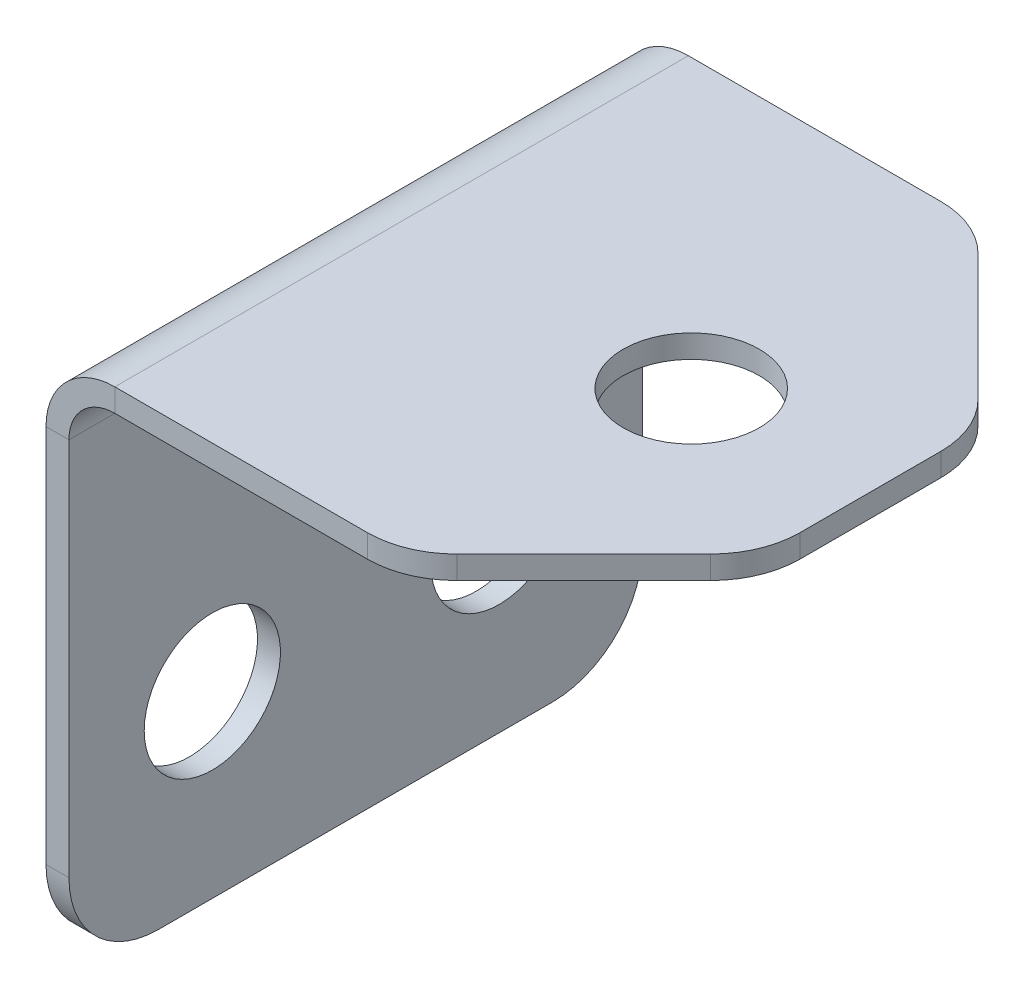
ISO-10303-21;
HEADER;
FILE_DESCRIPTION(('STEP AP214'),'2;1');
FILE_NAME('part.step','',(''),(''),'','','');
FILE_SCHEMA(('AUTOMOTIVE_DESIGN { 1 0 10303 214 1 1 1 1 }'));
ENDSEC;
DATA;
#1=APPLICATION_CONTEXT('core data for automotive mechanical design processes');
#2=APPLICATION_PROTOCOL_DEFINITION('international standard','automotive_design',2000,#1);
#3=PRODUCT_CONTEXT('',#1,'mechanical');
#4=PRODUCT('Part','Part','',(#3));
#5=PRODUCT_RELATED_PRODUCT_CATEGORY('part','',(#4));
#6=PRODUCT_DEFINITION_FORMATION('','',#4);
#7=PRODUCT_DEFINITION_CONTEXT('part definition',#1,'design');
#8=PRODUCT_DEFINITION('design','',#6,#7);
#9=PRODUCT_DEFINITION_SHAPE('','',#8);
#10=(LENGTH_UNIT() NAMED_UNIT(*) SI_UNIT(.MILLI.,.METRE.));
#11=(NAMED_UNIT(*) PLANE_ANGLE_UNIT() SI_UNIT($,.RADIAN.));
#12=(NAMED_UNIT(*) SI_UNIT($,.STERADIAN.) SOLID_ANGLE_UNIT());
#13=UNCERTAINTY_MEASURE_WITH_UNIT(LENGTH_MEASURE(1.E-05),#10,'distance_accuracy_value','');
#14=(GEOMETRIC_REPRESENTATION_CONTEXT(3) GLOBAL_UNCERTAINTY_ASSIGNED_CONTEXT((#13)) GLOBAL_UNIT_ASSIGNED_CONTEXT((#10,
#11,#12)) REPRESENTATION_CONTEXT('',''));
#15=CARTESIAN_POINT('',(0.,0.,0.));
#16=DIRECTION('',(0.,0.,1.));
#17=DIRECTION('',(1.,0.,0.));
#18=AXIS2_PLACEMENT_3D('',#15,#16,#17);
#19=CARTESIAN_POINT('',(0.64,0.,0.));
#20=DIRECTION('',(0.,0.,-1.));
#21=DIRECTION('',(0.,-1.,0.));
#22=AXIS2_PLACEMENT_3D('',#19,#20,#21);
#23=PLANE('',#22);
#24=DIRECTION('',(0.,1.,0.));
#25=VECTOR('',#24,1.);
#26=CARTESIAN_POINT('',(0.,0.,0.));
#27=LINE('',#26,#25);
#28=CARTESIAN_POINT('',(0.,13.08,0.));
#29=VERTEX_POINT('',#28);
#30=CARTESIAN_POINT('',(0.,2.5,0.));
#31=VERTEX_POINT('',#30);
#32=EDGE_CURVE('E253',#29,#31,#27,.F.);
#33=ORIENTED_EDGE('',*,*,#32,.T.);
#34=DIRECTION('',(-1.,0.,0.));
#35=VECTOR('',#34,1.);
#36=CARTESIAN_POINT('',(0.64,2.5,0.));
#37=LINE('',#36,#35);
#38=CARTESIAN_POINT('',(0.64,2.5,0.));
#39=VERTEX_POINT('',#38);
#40=EDGE_CURVE('E359',#31,#39,#37,.F.);
#41=ORIENTED_EDGE('',*,*,#40,.T.);
#42=DIRECTION('',(0.,-1.,0.));
#43=VECTOR('',#42,1.);
#44=CARTESIAN_POINT('',(0.64,0.,0.));
#45=LINE('',#44,#43);
#46=CARTESIAN_POINT('',(0.640000000000001,13.08,0.));
#47=VERTEX_POINT('',#46);
#48=EDGE_CURVE('E256',#47,#39,#45,.T.);
#49=ORIENTED_EDGE('',*,*,#48,.F.);
#50=DIRECTION('',(-1.,0.,0.));
#51=VECTOR('',#50,1.);
#52=CARTESIAN_POINT('',(0.640000000000001,13.08,0.));
#53=LINE('',#52,#51);
#54=EDGE_CURVE('E238',#47,#29,#53,.T.);
#55=ORIENTED_EDGE('',*,*,#54,.T.);
#56=EDGE_LOOP('',(#33,#41,#49,#55));
#57=FACE_BOUND('',#56,.T.);
#58=ADVANCED_FACE('F62',(#57),#23,.F.);
#59=CARTESIAN_POINT('',(0.64,0.,0.));
#60=DIRECTION('',(-1.,0.,0.));
#61=DIRECTION('',(0.,0.,1.));
#62=AXIS2_PLACEMENT_3D('',#59,#60,#61);
#63=PLANE('',#62);
#64=CARTESIAN_POINT('',(0.64,5.,-12.));
#65=DIRECTION('',(-1.,0.,0.));
#66=DIRECTION('',(0.,0.,1.));
#67=AXIS2_PLACEMENT_3D('',#64,#65,#66);
#68=CIRCLE('',#67,1.9);
#69=CARTESIAN_POINT('',(0.640000000000002,5.,-10.1));
#70=VERTEX_POINT('',#69);
#71=EDGE_CURVE('E233',#70,#70,#68,.T.);
#72=ORIENTED_EDGE('',*,*,#71,.T.);
#73=EDGE_LOOP('',(#72));
#74=FACE_BOUND('',#73,.T.);
#75=CARTESIAN_POINT('',(0.64,5.,-4.));
#76=DIRECTION('',(-1.,0.,0.));
#77=DIRECTION('',(0.,0.,1.));
#78=AXIS2_PLACEMENT_3D('',#75,#76,#77);
#79=CIRCLE('',#78,1.9);
#80=CARTESIAN_POINT('',(0.640000000000002,5.,-2.1));
#81=VERTEX_POINT('',#80);
#82=EDGE_CURVE('E398',#81,#81,#79,.T.);
#83=ORIENTED_EDGE('',*,*,#82,.T.);
#84=EDGE_LOOP('',(#83));
#85=FACE_BOUND('',#84,.T.);
#86=DIRECTION('',(0.,0.,-1.));
#87=VECTOR('',#86,1.);
#88=CARTESIAN_POINT('',(0.64,0.,0.));
#89=LINE('',#88,#87);
#90=CARTESIAN_POINT('',(0.64,0.,-2.5));
#91=VERTEX_POINT('',#90);
#92=CARTESIAN_POINT('',(0.64,0.,-13.5));
#93=VERTEX_POINT('',#92);
#94=EDGE_CURVE('E260',#91,#93,#89,.T.);
#95=ORIENTED_EDGE('',*,*,#94,.T.);
#96=CARTESIAN_POINT('',(0.64,2.5,-13.5));
#97=DIRECTION('',(-1.,0.,0.));
#98=DIRECTION('',(0.,0.,1.));
#99=AXIS2_PLACEMENT_3D('',#96,#97,#98);
#100=CIRCLE('',#99,2.5);
#101=CARTESIAN_POINT('',(0.64,2.5,-16.));
#102=VERTEX_POINT('',#101);
#103=EDGE_CURVE('E349',#93,#102,#100,.F.);
#104=ORIENTED_EDGE('',*,*,#103,.T.);
#105=DIRECTION('',(0.,1.,0.));
#106=VECTOR('',#105,1.);
#107=CARTESIAN_POINT('',(0.64,0.,-16.));
#108=LINE('',#107,#106);
#109=CARTESIAN_POINT('',(0.640000000000001,13.08,-16.));
#110=VERTEX_POINT('',#109);
#111=EDGE_CURVE('E265',#102,#110,#108,.T.);
#112=ORIENTED_EDGE('',*,*,#111,.T.);
#113=DIRECTION('',(0.,0.,1.));
#114=VECTOR('',#113,1.);
#115=CARTESIAN_POINT('',(0.640000000000001,13.08,0.));
#116=LINE('',#115,#114);
#117=EDGE_CURVE('E243',#47,#110,#116,.F.);
#118=ORIENTED_EDGE('',*,*,#117,.F.);
#119=ORIENTED_EDGE('',*,*,#48,.T.);
#120=CARTESIAN_POINT('',(0.64,2.5,-2.5));
#121=DIRECTION('',(-1.,0.,0.));
#122=DIRECTION('',(0.,0.,1.));
#123=AXIS2_PLACEMENT_3D('',#120,#121,#122);
#124=CIRCLE('',#123,2.5);
#125=EDGE_CURVE('E346',#39,#91,#124,.F.);
#126=ORIENTED_EDGE('',*,*,#125,.T.);
#127=EDGE_LOOP('',(#95,#104,#112,#118,#119,#126));
#128=FACE_BOUND('',#127,.T.);
#129=ADVANCED_FACE('F429',(#74,#85,#128),#63,.F.);
#130=CARTESIAN_POINT('',(0.,0.,0.));
#131=DIRECTION('',(-1.,0.,0.));
#132=DIRECTION('',(0.,0.,1.));
#133=AXIS2_PLACEMENT_3D('',#130,#131,#132);
#134=PLANE('',#133);
#135=CARTESIAN_POINT('',(0.,5.,-12.));
#136=DIRECTION('',(-1.,0.,0.));
#137=DIRECTION('',(0.,0.,1.));
#138=AXIS2_PLACEMENT_3D('',#135,#136,#137);
#139=CIRCLE('',#138,1.9);
#140=CARTESIAN_POINT('',(0.,5.,-10.1));
#141=VERTEX_POINT('',#140);
#142=EDGE_CURVE('E402',#141,#141,#139,.T.);
#143=ORIENTED_EDGE('',*,*,#142,.F.);
#144=EDGE_LOOP('',(#143));
#145=FACE_BOUND('',#144,.T.);
#146=CARTESIAN_POINT('',(0.,5.,-4.));
#147=DIRECTION('',(-1.,0.,0.));
#148=DIRECTION('',(0.,0.,1.));
#149=AXIS2_PLACEMENT_3D('',#146,#147,#148);
#150=CIRCLE('',#149,1.9);
#151=CARTESIAN_POINT('',(0.,5.,-2.1));
#152=VERTEX_POINT('',#151);
#153=EDGE_CURVE('E281',#152,#152,#150,.T.);
#154=ORIENTED_EDGE('',*,*,#153,.F.);
#155=EDGE_LOOP('',(#154));
#156=FACE_BOUND('',#155,.T.);
#157=DIRECTION('',(0.,1.,0.));
#158=VECTOR('',#157,1.);
#159=CARTESIAN_POINT('',(0.,0.,-16.));
#160=LINE('',#159,#158);
#161=CARTESIAN_POINT('',(0.,2.5,-16.));
#162=VERTEX_POINT('',#161);
#163=CARTESIAN_POINT('',(0.,13.08,-16.));
#164=VERTEX_POINT('',#163);
#165=EDGE_CURVE('E261',#162,#164,#160,.T.);
#166=ORIENTED_EDGE('',*,*,#165,.F.);
#167=CARTESIAN_POINT('',(0.,2.5,-13.5));
#168=DIRECTION('',(-1.,0.,0.));
#169=DIRECTION('',(0.,0.,1.));
#170=AXIS2_PLACEMENT_3D('',#167,#168,#169);
#171=CIRCLE('',#170,2.5);
#172=CARTESIAN_POINT('',(0.,0.,-13.5));
#173=VERTEX_POINT('',#172);
#174=EDGE_CURVE('E356',#162,#173,#171,.T.);
#175=ORIENTED_EDGE('',*,*,#174,.T.);
#176=DIRECTION('',(0.,0.,1.));
#177=VECTOR('',#176,1.);
#178=CARTESIAN_POINT('',(0.,0.,0.));
#179=LINE('',#178,#177);
#180=CARTESIAN_POINT('',(0.,0.,-2.5));
#181=VERTEX_POINT('',#180);
#182=EDGE_CURVE('E271',#181,#173,#179,.F.);
#183=ORIENTED_EDGE('',*,*,#182,.F.);
#184=CARTESIAN_POINT('',(0.,2.5,-2.5));
#185=DIRECTION('',(-1.,0.,0.));
#186=DIRECTION('',(0.,0.,1.));
#187=AXIS2_PLACEMENT_3D('',#184,#185,#186);
#188=CIRCLE('',#187,2.5);
#189=EDGE_CURVE('E78',#181,#31,#188,.T.);
#190=ORIENTED_EDGE('',*,*,#189,.T.);
#191=ORIENTED_EDGE('',*,*,#32,.F.);
#192=DIRECTION('',(0.,0.,1.));
#193=VECTOR('',#192,1.);
#194=CARTESIAN_POINT('',(0.,13.08,0.));
#195=LINE('',#194,#193);
#196=EDGE_CURVE('E200',#29,#164,#195,.F.);
#197=ORIENTED_EDGE('',*,*,#196,.T.);
#198=EDGE_LOOP('',(#166,#175,#183,#190,#191,#197));
#199=FACE_BOUND('',#198,.T.);
#200=ADVANCED_FACE('F435',(#145,#156,#199),#134,.T.);
#201=CARTESIAN_POINT('',(0.64,0.,-16.));
#202=DIRECTION('',(0.,0.,1.));
#203=DIRECTION('',(0.,1.,0.));
#204=AXIS2_PLACEMENT_3D('',#201,#202,#203);
#205=PLANE('',#204);
#206=ORIENTED_EDGE('',*,*,#111,.F.);
#207=DIRECTION('',(-1.,0.,0.));
#208=VECTOR('',#207,1.);
#209=CARTESIAN_POINT('',(0.64,2.5,-16.));
#210=LINE('',#209,#208);
#211=EDGE_CURVE('E86',#102,#162,#210,.T.);
#212=ORIENTED_EDGE('',*,*,#211,.T.);
#213=ORIENTED_EDGE('',*,*,#165,.T.);
#214=DIRECTION('',(-1.,0.,0.));
#215=VECTOR('',#214,1.);
#216=CARTESIAN_POINT('',(0.640000000000001,13.08,-16.));
#217=LINE('',#216,#215);
#218=EDGE_CURVE('E249',#110,#164,#217,.T.);
#219=ORIENTED_EDGE('',*,*,#218,.F.);
#220=EDGE_LOOP('',(#206,#212,#213,#219));
#221=FACE_BOUND('',#220,.T.);
#222=ADVANCED_FACE('F440',(#221),#205,.F.);
#223=CARTESIAN_POINT('',(0.64,0.,0.));
#224=DIRECTION('',(0.,1.,0.));
#225=DIRECTION('',(0.,0.,-1.));
#226=AXIS2_PLACEMENT_3D('',#223,#224,#225);
#227=PLANE('',#226);
#228=ORIENTED_EDGE('',*,*,#182,.T.);
#229=DIRECTION('',(-1.,0.,0.));
#230=VECTOR('',#229,1.);
#231=CARTESIAN_POINT('',(0.64,0.,-13.5));
#232=LINE('',#231,#230);
#233=EDGE_CURVE('E342',#173,#93,#232,.F.);
#234=ORIENTED_EDGE('',*,*,#233,.T.);
#235=ORIENTED_EDGE('',*,*,#94,.F.);
#236=DIRECTION('',(-1.,0.,0.));
#237=VECTOR('',#236,1.);
#238=CARTESIAN_POINT('',(0.64,0.,-2.5));
#239=LINE('',#238,#237);
#240=EDGE_CURVE('E339',#91,#181,#239,.T.);
#241=ORIENTED_EDGE('',*,*,#240,.T.);
#242=EDGE_LOOP('',(#228,#234,#235,#241));
#243=FACE_BOUND('',#242,.T.);
#244=ADVANCED_FACE('F443',(#243),#227,.F.);
#245=CARTESIAN_POINT('',(1.92,13.08,-16.));
#246=DIRECTION('',(0.,0.,-1.));
#247=DIRECTION('',(-1.,0.,0.));
#248=AXIS2_PLACEMENT_3D('',#245,#246,#247);
#249=PLANE('',#248);
#250=DIRECTION('',(0.,1.,0.));
#251=VECTOR('',#250,1.);
#252=CARTESIAN_POINT('',(1.91999999999999,15.,-16.));
#253=LINE('',#252,#251);
#254=CARTESIAN_POINT('',(1.92,14.36,-16.));
#255=VERTEX_POINT('',#254);
#256=CARTESIAN_POINT('',(1.91999999999999,15.,-16.));
#257=VERTEX_POINT('',#256);
#258=EDGE_CURVE('E229',#255,#257,#253,.T.);
#259=ORIENTED_EDGE('',*,*,#258,.F.);
#260=CARTESIAN_POINT('',(1.92,13.08,-16.));
#261=DIRECTION('',(0.,0.,1.));
#262=DIRECTION('',(1.,0.,0.));
#263=AXIS2_PLACEMENT_3D('',#260,#261,#262);
#264=CIRCLE('',#263,1.28);
#265=EDGE_CURVE('E204',#110,#255,#264,.F.);
#266=ORIENTED_EDGE('',*,*,#265,.F.);
#267=ORIENTED_EDGE('',*,*,#218,.T.);
#268=CARTESIAN_POINT('',(1.92,13.08,-16.));
#269=DIRECTION('',(0.,0.,1.));
#270=DIRECTION('',(1.,0.,0.));
#271=AXIS2_PLACEMENT_3D('',#268,#269,#270);
#272=CIRCLE('',#271,1.92);
#273=EDGE_CURVE('E236',#164,#257,#272,.F.);
#274=ORIENTED_EDGE('',*,*,#273,.T.);
#275=EDGE_LOOP('',(#259,#266,#267,#274));
#276=FACE_BOUND('',#275,.T.);
#277=ADVANCED_FACE('F446',(#276),#249,.T.);
#278=CARTESIAN_POINT('',(1.92,13.08,0.));
#279=DIRECTION('',(0.,0.,-1.));
#280=DIRECTION('',(-1.,0.,0.));
#281=AXIS2_PLACEMENT_3D('',#278,#279,#280);
#282=PLANE('',#281);
#283=CARTESIAN_POINT('',(1.92,13.08,0.));
#284=DIRECTION('',(0.,0.,1.));
#285=DIRECTION('',(1.,0.,0.));
#286=AXIS2_PLACEMENT_3D('',#283,#284,#285);
#287=CIRCLE('',#286,1.28);
#288=CARTESIAN_POINT('',(1.92,14.36,0.));
#289=VERTEX_POINT('',#288);
#290=EDGE_CURVE('E189',#289,#47,#287,.T.);
#291=ORIENTED_EDGE('',*,*,#290,.F.);
#292=DIRECTION('',(0.,1.,0.));
#293=VECTOR('',#292,1.);
#294=CARTESIAN_POINT('',(1.92,14.36,0.));
#295=LINE('',#294,#293);
#296=CARTESIAN_POINT('',(1.91999999999999,15.,0.));
#297=VERTEX_POINT('',#296);
#298=EDGE_CURVE('E184',#289,#297,#295,.T.);
#299=ORIENTED_EDGE('',*,*,#298,.T.);
#300=CARTESIAN_POINT('',(1.92,13.08,0.));
#301=DIRECTION('',(0.,0.,1.));
#302=DIRECTION('',(1.,0.,0.));
#303=AXIS2_PLACEMENT_3D('',#300,#301,#302);
#304=CIRCLE('',#303,1.92);
#305=EDGE_CURVE('E194',#297,#29,#304,.T.);
#306=ORIENTED_EDGE('',*,*,#305,.T.);
#307=ORIENTED_EDGE('',*,*,#54,.F.);
#308=EDGE_LOOP('',(#291,#299,#306,#307));
#309=FACE_BOUND('',#308,.T.);
#310=ADVANCED_FACE('F207',(#309),#282,.F.);
#311=CARTESIAN_POINT('',(1.92,13.08,0.));
#312=DIRECTION('',(0.,0.,1.));
#313=DIRECTION('',(0.,1.,0.));
#314=AXIS2_PLACEMENT_3D('',#311,#312,#313);
#315=CYLINDRICAL_SURFACE('',#314,1.92);
#316=ORIENTED_EDGE('',*,*,#196,.F.);
#317=ORIENTED_EDGE('',*,*,#305,.F.);
#318=DIRECTION('',(0.,0.,1.));
#319=VECTOR('',#318,1.);
#320=CARTESIAN_POINT('',(1.91999999999999,15.,0.));
#321=LINE('',#320,#319);
#322=EDGE_CURVE('E197',#257,#297,#321,.T.);
#323=ORIENTED_EDGE('',*,*,#322,.F.);
#324=ORIENTED_EDGE('',*,*,#273,.F.);
#325=EDGE_LOOP('',(#316,#317,#323,#324));
#326=FACE_BOUND('',#325,.T.);
#327=ADVANCED_FACE('F195',(#326),#315,.T.);
#328=CARTESIAN_POINT('',(1.92,13.08,0.));
#329=DIRECTION('',(0.,0.,1.));
#330=DIRECTION('',(0.,1.,0.));
#331=AXIS2_PLACEMENT_3D('',#328,#329,#330);
#332=CYLINDRICAL_SURFACE('',#331,1.28);
#333=ORIENTED_EDGE('',*,*,#117,.T.);
#334=ORIENTED_EDGE('',*,*,#265,.T.);
#335=DIRECTION('',(0.,0.,-1.));
#336=VECTOR('',#335,1.);
#337=CARTESIAN_POINT('',(1.92,14.36,-16.));
#338=LINE('',#337,#336);
#339=EDGE_CURVE('E210',#255,#289,#338,.F.);
#340=ORIENTED_EDGE('',*,*,#339,.T.);
#341=ORIENTED_EDGE('',*,*,#290,.T.);
#342=EDGE_LOOP('',(#333,#334,#340,#341));
#343=FACE_BOUND('',#342,.T.);
#344=ADVANCED_FACE('F486',(#343),#332,.F.);
#345=CARTESIAN_POINT('',(0.639999999999998,15.,0.));
#346=DIRECTION('',(0.,0.,1.));
#347=DIRECTION('',(1.,0.,0.));
#348=AXIS2_PLACEMENT_3D('',#345,#346,#347);
#349=PLANE('',#348);
#350=DIRECTION('',(1.,0.,0.));
#351=VECTOR('',#350,1.);
#352=CARTESIAN_POINT('',(0.,14.36,0.));
#353=LINE('',#352,#351);
#354=CARTESIAN_POINT('',(8.96446609406725,14.36,0.));
#355=VERTEX_POINT('',#354);
#356=EDGE_CURVE('E387',#355,#289,#353,.F.);
#357=ORIENTED_EDGE('',*,*,#356,.F.);
#358=DIRECTION('',(0.,-1.,0.));
#359=VECTOR('',#358,1.);
#360=CARTESIAN_POINT('',(8.96446609406725,15.,0.));
#361=LINE('',#360,#359);
#362=CARTESIAN_POINT('',(8.96446609406725,15.,0.));
#363=VERTEX_POINT('',#362);
#364=EDGE_CURVE('E13',#355,#363,#361,.F.);
#365=ORIENTED_EDGE('',*,*,#364,.T.);
#366=DIRECTION('',(-1.,0.,0.));
#367=VECTOR('',#366,1.);
#368=CARTESIAN_POINT('',(0.639999999999998,15.,0.));
#369=LINE('',#368,#367);
#370=EDGE_CURVE('E179',#363,#297,#369,.T.);
#371=ORIENTED_EDGE('',*,*,#370,.T.);
#372=ORIENTED_EDGE('',*,*,#298,.F.);
#373=EDGE_LOOP('',(#357,#365,#371,#372));
#374=FACE_BOUND('',#373,.T.);
#375=ADVANCED_FACE('F182',(#374),#349,.T.);
#376=CARTESIAN_POINT('',(15.,15.,-16.));
#377=DIRECTION('',(0.,0.,-1.));
#378=DIRECTION('',(-1.,0.,0.));
#379=AXIS2_PLACEMENT_3D('',#376,#377,#378);
#380=PLANE('',#379);
#381=DIRECTION('',(1.,0.,0.));
#382=VECTOR('',#381,1.);
#383=CARTESIAN_POINT('',(15.,15.,-16.));
#384=LINE('',#383,#382);
#385=CARTESIAN_POINT('',(8.96446609406726,15.,-16.));
#386=VERTEX_POINT('',#385);
#387=EDGE_CURVE('E216',#257,#386,#384,.T.);
#388=ORIENTED_EDGE('',*,*,#387,.T.);
#389=DIRECTION('',(0.,1.,0.));
#390=VECTOR('',#389,1.);
#391=CARTESIAN_POINT('',(8.96446609406726,15.,-16.));
#392=LINE('',#391,#390);
#393=CARTESIAN_POINT('',(8.96446609406726,14.36,-16.));
#394=VERTEX_POINT('',#393);
#395=EDGE_CURVE('E297',#386,#394,#392,.F.);
#396=ORIENTED_EDGE('',*,*,#395,.T.);
#397=DIRECTION('',(-1.,0.,0.));
#398=VECTOR('',#397,1.);
#399=CARTESIAN_POINT('',(0.,14.36,-16.));
#400=LINE('',#399,#398);
#401=EDGE_CURVE('E218',#255,#394,#400,.F.);
#402=ORIENTED_EDGE('',*,*,#401,.F.);
#403=ORIENTED_EDGE('',*,*,#258,.T.);
#404=EDGE_LOOP('',(#388,#396,#402,#403));
#405=FACE_BOUND('',#404,.T.);
#406=ADVANCED_FACE('F417',(#405),#380,.T.);
#407=CARTESIAN_POINT('',(0.,15.,0.));
#408=DIRECTION('',(0.,1.,0.));
#409=DIRECTION('',(-1.,0.,0.));
#410=AXIS2_PLACEMENT_3D('',#407,#408,#409);
#411=PLANE('',#410);
#412=CARTESIAN_POINT('',(10.,15.,-8.));
#413=DIRECTION('',(0.,1.,0.));
#414=DIRECTION('',(-1.,0.,0.));
#415=AXIS2_PLACEMENT_3D('',#412,#413,#414);
#416=CIRCLE('',#415,1.9);
#417=CARTESIAN_POINT('',(8.1,15.,-8.));
#418=VERTEX_POINT('',#417);
#419=EDGE_CURVE('E282',#418,#418,#416,.T.);
#420=ORIENTED_EDGE('',*,*,#419,.F.);
#421=EDGE_LOOP('',(#420));
#422=FACE_BOUND('',#421,.T.);
#423=DIRECTION('',(0.707106781186546,0.,0.707106781186549));
#424=VECTOR('',#423,1.);
#425=CARTESIAN_POINT('',(13.,15.,-13.));
#426=LINE('',#425,#424);
#427=CARTESIAN_POINT('',(14.2677669529664,15.,-11.7322330470336));
#428=VERTEX_POINT('',#427);
#429=CARTESIAN_POINT('',(10.7322330470336,15.,-15.2677669529664));
#430=VERTEX_POINT('',#429);
#431=EDGE_CURVE('E294',#428,#430,#426,.F.);
#432=ORIENTED_EDGE('',*,*,#431,.T.);
#433=CARTESIAN_POINT('',(8.96446609406726,15.,-13.5));
#434=DIRECTION('',(0.,1.,0.));
#435=DIRECTION('',(-1.,0.,0.));
#436=AXIS2_PLACEMENT_3D('',#433,#434,#435);
#437=CIRCLE('',#436,2.5);
#438=EDGE_CURVE('E328',#430,#386,#437,.T.);
#439=ORIENTED_EDGE('',*,*,#438,.T.);
#440=ORIENTED_EDGE('',*,*,#387,.F.);
#441=ORIENTED_EDGE('',*,*,#322,.T.);
#442=ORIENTED_EDGE('',*,*,#370,.F.);
#443=CARTESIAN_POINT('',(8.96446609406725,15.,-2.5));
#444=DIRECTION('',(0.,1.,0.));
#445=DIRECTION('',(-1.,0.,0.));
#446=AXIS2_PLACEMENT_3D('',#443,#444,#445);
#447=CIRCLE('',#446,2.5);
#448=CARTESIAN_POINT('',(10.7322330470336,15.,-0.732233047033626));
#449=VERTEX_POINT('',#448);
#450=EDGE_CURVE('E319',#363,#449,#447,.T.);
#451=ORIENTED_EDGE('',*,*,#450,.T.);
#452=DIRECTION('',(-0.707106781186549,0.,0.707106781186546));
#453=VECTOR('',#452,1.);
#454=CARTESIAN_POINT('',(4.99999999999995,15.,5.00000000000002));
#455=LINE('',#454,#453);
#456=CARTESIAN_POINT('',(14.2677669529664,15.,-4.26776695296637));
#457=VERTEX_POINT('',#456);
#458=EDGE_CURVE('E290',#449,#457,#455,.F.);
#459=ORIENTED_EDGE('',*,*,#458,.T.);
#460=CARTESIAN_POINT('',(12.5,15.,-6.03553390593274));
#461=DIRECTION('',(0.,1.,0.));
#462=DIRECTION('',(-1.,0.,0.));
#463=AXIS2_PLACEMENT_3D('',#460,#461,#462);
#464=CIRCLE('',#463,2.5);
#465=CARTESIAN_POINT('',(15.,15.,-6.03553390593274));
#466=VERTEX_POINT('',#465);
#467=EDGE_CURVE('E322',#457,#466,#464,.T.);
#468=ORIENTED_EDGE('',*,*,#467,.T.);
#469=DIRECTION('',(0.,0.,1.));
#470=VECTOR('',#469,1.);
#471=CARTESIAN_POINT('',(15.,15.,0.));
#472=LINE('',#471,#470);
#473=CARTESIAN_POINT('',(15.,15.,-9.96446609406724));
#474=VERTEX_POINT('',#473);
#475=EDGE_CURVE('E190',#474,#466,#472,.T.);
#476=ORIENTED_EDGE('',*,*,#475,.F.);
#477=CARTESIAN_POINT('',(12.5,15.,-9.96446609406724));
#478=DIRECTION('',(0.,1.,0.));
#479=DIRECTION('',(-1.,0.,0.));
#480=AXIS2_PLACEMENT_3D('',#477,#478,#479);
#481=CIRCLE('',#480,2.5);
#482=EDGE_CURVE('E325',#474,#428,#481,.T.);
#483=ORIENTED_EDGE('',*,*,#482,.T.);
#484=EDGE_LOOP('',(#432,#439,#440,#441,#442,#451,#459,#468,#476,#483));
#485=FACE_BOUND('',#484,.T.);
#486=ADVANCED_FACE('F214',(#422,#485),#411,.T.);
#487=CARTESIAN_POINT('',(0.,14.36,0.));
#488=DIRECTION('',(0.,1.,0.));
#489=DIRECTION('',(-1.,0.,0.));
#490=AXIS2_PLACEMENT_3D('',#487,#488,#489);
#491=PLANE('',#490);
#492=CARTESIAN_POINT('',(10.,14.36,-8.));
#493=DIRECTION('',(0.,1.,0.));
#494=DIRECTION('',(-1.,0.,0.));
#495=AXIS2_PLACEMENT_3D('',#492,#493,#494);
#496=CIRCLE('',#495,1.9);
#497=CARTESIAN_POINT('',(8.1,14.36,-8.));
#498=VERTEX_POINT('',#497);
#499=EDGE_CURVE('E277',#498,#498,#496,.T.);
#500=ORIENTED_EDGE('',*,*,#499,.T.);
#501=EDGE_LOOP('',(#500));
#502=FACE_BOUND('',#501,.T.);
#503=ORIENTED_EDGE('',*,*,#401,.T.);
#504=CARTESIAN_POINT('',(8.96446609406726,14.36,-13.5));
#505=DIRECTION('',(0.,1.,0.));
#506=DIRECTION('',(-1.,0.,0.));
#507=AXIS2_PLACEMENT_3D('',#504,#505,#506);
#508=CIRCLE('',#507,2.5);
#509=CARTESIAN_POINT('',(10.7322330470336,14.36,-15.2677669529664));
#510=VERTEX_POINT('',#509);
#511=EDGE_CURVE('E310',#394,#510,#508,.F.);
#512=ORIENTED_EDGE('',*,*,#511,.T.);
#513=DIRECTION('',(-0.707106781186546,0.,-0.707106781186549));
#514=VECTOR('',#513,1.);
#515=CARTESIAN_POINT('',(10.,14.36,-16.));
#516=LINE('',#515,#514);
#517=CARTESIAN_POINT('',(14.2677669529664,14.36,-11.7322330470336));
#518=VERTEX_POINT('',#517);
#519=EDGE_CURVE('E286',#510,#518,#516,.F.);
#520=ORIENTED_EDGE('',*,*,#519,.T.);
#521=CARTESIAN_POINT('',(12.5,14.36,-9.96446609406724));
#522=DIRECTION('',(0.,1.,0.));
#523=DIRECTION('',(-1.,0.,0.));
#524=AXIS2_PLACEMENT_3D('',#521,#522,#523);
#525=CIRCLE('',#524,2.5);
#526=CARTESIAN_POINT('',(15.,14.36,-9.96446609406724));
#527=VERTEX_POINT('',#526);
#528=EDGE_CURVE('E307',#518,#527,#525,.F.);
#529=ORIENTED_EDGE('',*,*,#528,.T.);
#530=DIRECTION('',(0.,0.,-1.));
#531=VECTOR('',#530,1.);
#532=CARTESIAN_POINT('',(15.,14.36,0.));
#533=LINE('',#532,#531);
#534=CARTESIAN_POINT('',(15.,14.36,-6.03553390593274));
#535=VERTEX_POINT('',#534);
#536=EDGE_CURVE('E222',#527,#535,#533,.F.);
#537=ORIENTED_EDGE('',*,*,#536,.T.);
#538=CARTESIAN_POINT('',(12.5,14.36,-6.03553390593274));
#539=DIRECTION('',(0.,1.,0.));
#540=DIRECTION('',(-1.,0.,0.));
#541=AXIS2_PLACEMENT_3D('',#538,#539,#540);
#542=CIRCLE('',#541,2.5);
#543=CARTESIAN_POINT('',(14.2677669529664,14.36,-4.26776695296636));
#544=VERTEX_POINT('',#543);
#545=EDGE_CURVE('E304',#535,#544,#542,.F.);
#546=ORIENTED_EDGE('',*,*,#545,.T.);
#547=DIRECTION('',(0.707106781186549,0.,-0.707106781186546));
#548=VECTOR('',#547,1.);
#549=CARTESIAN_POINT('',(15.,14.36,-4.99999999999999));
#550=LINE('',#549,#548);
#551=CARTESIAN_POINT('',(10.7322330470336,14.36,-0.732233047033626));
#552=VERTEX_POINT('',#551);
#553=EDGE_CURVE('E268',#544,#552,#550,.F.);
#554=ORIENTED_EDGE('',*,*,#553,.T.);
#555=CARTESIAN_POINT('',(8.96446609406725,14.36,-2.5));
#556=DIRECTION('',(0.,1.,0.));
#557=DIRECTION('',(-1.,0.,0.));
#558=AXIS2_PLACEMENT_3D('',#555,#556,#557);
#559=CIRCLE('',#558,2.5);
#560=EDGE_CURVE('E301',#552,#355,#559,.F.);
#561=ORIENTED_EDGE('',*,*,#560,.T.);
#562=ORIENTED_EDGE('',*,*,#356,.T.);
#563=ORIENTED_EDGE('',*,*,#339,.F.);
#564=EDGE_LOOP('',(#503,#512,#520,#529,#537,#546,#554,#561,#562,#563));
#565=FACE_BOUND('',#564,.T.);
#566=ADVANCED_FACE('F384',(#502,#565),#491,.F.);
#567=CARTESIAN_POINT('',(15.,15.,0.));
#568=DIRECTION('',(1.,0.,0.));
#569=DIRECTION('',(0.,1.,0.));
#570=AXIS2_PLACEMENT_3D('',#567,#568,#569);
#571=PLANE('',#570);
#572=ORIENTED_EDGE('',*,*,#536,.F.);
#573=DIRECTION('',(0.,-1.,0.));
#574=VECTOR('',#573,1.);
#575=CARTESIAN_POINT('',(15.,15.,-9.96446609406724));
#576=LINE('',#575,#574);
#577=EDGE_CURVE('E335',#527,#474,#576,.F.);
#578=ORIENTED_EDGE('',*,*,#577,.T.);
#579=ORIENTED_EDGE('',*,*,#475,.T.);
#580=DIRECTION('',(0.,1.,0.));
#581=VECTOR('',#580,1.);
#582=CARTESIAN_POINT('',(15.,15.,-6.03553390593274));
#583=LINE('',#582,#581);
#584=EDGE_CURVE('E331',#466,#535,#583,.F.);
#585=ORIENTED_EDGE('',*,*,#584,.T.);
#586=EDGE_LOOP('',(#572,#578,#579,#585));
#587=FACE_BOUND('',#586,.T.);
#588=ADVANCED_FACE('F381',(#587),#571,.T.);
#589=CARTESIAN_POINT('',(15.,5.,-4.));
#590=DIRECTION('',(-1.,0.,0.));
#591=DIRECTION('',(0.,0.,1.));
#592=AXIS2_PLACEMENT_3D('',#589,#590,#591);
#593=CYLINDRICAL_SURFACE('',#592,1.9);
#594=CARTESIAN_POINT('',(0.,5.,-2.1));
#595=CARTESIAN_POINT('',(0.00666666666666639,5.,-2.1));
#596=CARTESIAN_POINT('',(0.0133333333333328,5.,-2.1));
#597=CARTESIAN_POINT('',(0.0266666666666662,5.,-2.1));
#598=CARTESIAN_POINT('',(0.0333333333333331,5.,-2.1));
#599=CARTESIAN_POINT('',(0.0466666666666671,5.,-2.1));
#600=CARTESIAN_POINT('',(0.0533333333333341,5.,-2.1));
#601=CARTESIAN_POINT('',(0.0666666666666674,5.,-2.1));
#602=CARTESIAN_POINT('',(0.0733333333333338,5.,-2.1));
#603=CARTESIAN_POINT('',(0.0866666666666666,5.,-2.1));
#604=CARTESIAN_POINT('',(0.093333333333333,5.,-2.1));
#605=CARTESIAN_POINT('',(0.106666666666666,5.,-2.1));
#606=CARTESIAN_POINT('',(0.113333333333333,5.,-2.1));
#607=CARTESIAN_POINT('',(0.126666666666667,5.,-2.1));
#608=CARTESIAN_POINT('',(0.133333333333334,5.,-2.1));
#609=CARTESIAN_POINT('',(0.146666666666668,5.,-2.1));
#610=CARTESIAN_POINT('',(0.153333333333334,5.,-2.1));
#611=CARTESIAN_POINT('',(0.166666666666667,5.,-2.1));
#612=CARTESIAN_POINT('',(0.173333333333333,5.,-2.1));
#613=CARTESIAN_POINT('',(0.186666666666667,5.,-2.1));
#614=CARTESIAN_POINT('',(0.193333333333334,5.,-2.1));
#615=CARTESIAN_POINT('',(0.206666666666667,5.,-2.1));
#616=CARTESIAN_POINT('',(0.213333333333334,5.,-2.1));
#617=CARTESIAN_POINT('',(0.226666666666668,5.,-2.1));
#618=CARTESIAN_POINT('',(0.233333333333334,5.,-2.1));
#619=CARTESIAN_POINT('',(0.246666666666667,5.,-2.1));
#620=CARTESIAN_POINT('',(0.253333333333333,5.,-2.1));
#621=CARTESIAN_POINT('',(0.266666666666667,5.,-2.1));
#622=CARTESIAN_POINT('',(0.273333333333334,5.,-2.1));
#623=CARTESIAN_POINT('',(0.286666666666668,5.,-2.1));
#624=CARTESIAN_POINT('',(0.293333333333335,5.,-2.1));
#625=CARTESIAN_POINT('',(0.306666666666668,5.,-2.1));
#626=CARTESIAN_POINT('',(0.313333333333334,5.,-2.1));
#627=CARTESIAN_POINT('',(0.326666666666667,5.,-2.1));
#628=CARTESIAN_POINT('',(0.333333333333334,5.,-2.1));
#629=CARTESIAN_POINT('',(0.346666666666667,5.,-2.1));
#630=CARTESIAN_POINT('',(0.353333333333334,5.,-2.1));
#631=CARTESIAN_POINT('',(0.366666666666668,5.,-2.1));
#632=CARTESIAN_POINT('',(0.373333333333335,5.,-2.1));
#633=CARTESIAN_POINT('',(0.386666666666668,5.,-2.1));
#634=CARTESIAN_POINT('',(0.393333333333335,5.,-2.1));
#635=CARTESIAN_POINT('',(0.406666666666667,5.,-2.1));
#636=CARTESIAN_POINT('',(0.413333333333334,5.,-2.1));
#637=CARTESIAN_POINT('',(0.426666666666667,5.,-2.1));
#638=CARTESIAN_POINT('',(0.433333333333334,5.,-2.1));
#639=CARTESIAN_POINT('',(0.446666666666668,5.,-2.1));
#640=CARTESIAN_POINT('',(0.453333333333335,5.,-2.1));
#641=CARTESIAN_POINT('',(0.466666666666668,5.,-2.1));
#642=CARTESIAN_POINT('',(0.473333333333335,5.,-2.1));
#643=CARTESIAN_POINT('',(0.486666666666668,5.,-2.1));
#644=CARTESIAN_POINT('',(0.493333333333334,5.,-2.1));
#645=CARTESIAN_POINT('',(0.506666666666667,5.,-2.1));
#646=CARTESIAN_POINT('',(0.513333333333334,5.,-2.1));
#647=CARTESIAN_POINT('',(0.526666666666668,5.,-2.1));
#648=CARTESIAN_POINT('',(0.533333333333335,5.,-2.1));
#649=CARTESIAN_POINT('',(0.546666666666669,5.,-2.1));
#650=CARTESIAN_POINT('',(0.553333333333335,5.,-2.1));
#651=CARTESIAN_POINT('',(0.566666666666668,5.,-2.1));
#652=CARTESIAN_POINT('',(0.573333333333334,5.,-2.1));
#653=CARTESIAN_POINT('',(0.586666666666668,5.,-2.1));
#654=CARTESIAN_POINT('',(0.593333333333335,5.,-2.1));
#655=CARTESIAN_POINT('',(0.606666666666669,5.,-2.1));
#656=CARTESIAN_POINT('',(0.613333333333336,5.,-2.1));
#657=CARTESIAN_POINT('',(0.626666666666669,5.,-2.1));
#658=CARTESIAN_POINT('',(0.633333333333335,5.,-2.1));
#659=CARTESIAN_POINT('',(0.640000000000002,5.,-2.1));
#660=B_SPLINE_CURVE_WITH_KNOTS('',3,(#594,#595,#596,#597,#598,#599,#600,#601,#602,#603,#604,
#605,#606,#607,#608,#609,#610,#611,#612,#613,#614,#615,#616,#617,#618,#619,#620,#621,#622,#623,
#624,#625,#626,#627,#628,#629,#630,#631,#632,#633,#634,#635,#636,#637,#638,#639,#640,#641,#642,
#643,#644,#645,#646,#647,#648,#649,#650,#651,#652,#653,#654,#655,#656,#657,#658,#659),
.UNSPECIFIED.,.F.,.F.,(4,2,2,2,2,2,2,2,2,2,2,2,2,2,2,2,2,2,2,2,2,2,2,2,2,2,2,2,2,2,2,2,4),(0.,
0.0199999999999992,0.0400000000000001,0.060000000000001,0.0800000000000002,0.0999999999999994,
0.12,0.140000000000001,0.16,0.18,0.200000000000001,0.220000000000001,0.240000000000001,0.26,
0.280000000000001,0.300000000000002,0.320000000000001,0.34,0.360000000000001,0.380000000000002,
0.400000000000001,0.42,0.440000000000001,0.460000000000002,0.480000000000001,0.5,
0.520000000000001,0.540000000000002,0.560000000000001,0.580000000000001,0.600000000000002,
0.620000000000003,0.640000000000002),.UNSPECIFIED.);
#661=EDGE_CURVE('BSEAM512',#152,#81,#660,.T.);
#662=ORIENTED_EDGE('',*,*,#153,.T.);
#663=ORIENTED_EDGE('',*,*,#82,.F.);
#664=ORIENTED_EDGE('',*,*,#661,.T.);
#665=ORIENTED_EDGE('',*,*,#661,.F.);
#666=EDGE_LOOP('',(#662,#664,#663,#665));
#667=FACE_BOUND('',#666,.T.);
#668=ADVANCED_FACE('F512',(#667),#593,.F.);
#669=CARTESIAN_POINT('',(15.,5.,-12.));
#670=DIRECTION('',(-1.,0.,0.));
#671=DIRECTION('',(0.,0.,1.));
#672=AXIS2_PLACEMENT_3D('',#669,#670,#671);
#673=CYLINDRICAL_SURFACE('',#672,1.9);
#674=CARTESIAN_POINT('',(0.,5.,-10.1));
#675=CARTESIAN_POINT('',(0.00666666666666639,5.,-10.1));
#676=CARTESIAN_POINT('',(0.0133333333333328,5.,-10.1));
#677=CARTESIAN_POINT('',(0.0266666666666662,5.,-10.1));
#678=CARTESIAN_POINT('',(0.0333333333333331,5.,-10.1));
#679=CARTESIAN_POINT('',(0.0466666666666671,5.,-10.1));
#680=CARTESIAN_POINT('',(0.0533333333333341,5.,-10.1));
#681=CARTESIAN_POINT('',(0.0666666666666674,5.,-10.1));
#682=CARTESIAN_POINT('',(0.0733333333333338,5.,-10.1));
#683=CARTESIAN_POINT('',(0.0866666666666666,5.,-10.1));
#684=CARTESIAN_POINT('',(0.093333333333333,5.,-10.1));
#685=CARTESIAN_POINT('',(0.106666666666666,5.,-10.1));
#686=CARTESIAN_POINT('',(0.113333333333333,5.,-10.1));
#687=CARTESIAN_POINT('',(0.126666666666667,5.,-10.1));
#688=CARTESIAN_POINT('',(0.133333333333334,5.,-10.1));
#689=CARTESIAN_POINT('',(0.146666666666668,5.,-10.1));
#690=CARTESIAN_POINT('',(0.153333333333334,5.,-10.1));
#691=CARTESIAN_POINT('',(0.166666666666667,5.,-10.1));
#692=CARTESIAN_POINT('',(0.173333333333333,5.,-10.1));
#693=CARTESIAN_POINT('',(0.186666666666667,5.,-10.1));
#694=CARTESIAN_POINT('',(0.193333333333334,5.,-10.1));
#695=CARTESIAN_POINT('',(0.206666666666667,5.,-10.1));
#696=CARTESIAN_POINT('',(0.213333333333334,5.,-10.1));
#697=CARTESIAN_POINT('',(0.226666666666668,5.,-10.1));
#698=CARTESIAN_POINT('',(0.233333333333334,5.,-10.1));
#699=CARTESIAN_POINT('',(0.246666666666667,5.,-10.1));
#700=CARTESIAN_POINT('',(0.253333333333333,5.,-10.1));
#701=CARTESIAN_POINT('',(0.266666666666667,5.,-10.1));
#702=CARTESIAN_POINT('',(0.273333333333334,5.,-10.1));
#703=CARTESIAN_POINT('',(0.286666666666668,5.,-10.1));
#704=CARTESIAN_POINT('',(0.293333333333335,5.,-10.1));
#705=CARTESIAN_POINT('',(0.306666666666668,5.,-10.1));
#706=CARTESIAN_POINT('',(0.313333333333334,5.,-10.1));
#707=CARTESIAN_POINT('',(0.326666666666667,5.,-10.1));
#708=CARTESIAN_POINT('',(0.333333333333334,5.,-10.1));
#709=CARTESIAN_POINT('',(0.346666666666667,5.,-10.1));
#710=CARTESIAN_POINT('',(0.353333333333334,5.,-10.1));
#711=CARTESIAN_POINT('',(0.366666666666668,5.,-10.1));
#712=CARTESIAN_POINT('',(0.373333333333335,5.,-10.1));
#713=CARTESIAN_POINT('',(0.386666666666668,5.,-10.1));
#714=CARTESIAN_POINT('',(0.393333333333335,5.,-10.1));
#715=CARTESIAN_POINT('',(0.406666666666667,5.,-10.1));
#716=CARTESIAN_POINT('',(0.413333333333334,5.,-10.1));
#717=CARTESIAN_POINT('',(0.426666666666667,5.,-10.1));
#718=CARTESIAN_POINT('',(0.433333333333334,5.,-10.1));
#719=CARTESIAN_POINT('',(0.446666666666668,5.,-10.1));
#720=CARTESIAN_POINT('',(0.453333333333335,5.,-10.1));
#721=CARTESIAN_POINT('',(0.466666666666668,5.,-10.1));
#722=CARTESIAN_POINT('',(0.473333333333335,5.,-10.1));
#723=CARTESIAN_POINT('',(0.486666666666668,5.,-10.1));
#724=CARTESIAN_POINT('',(0.493333333333334,5.,-10.1));
#725=CARTESIAN_POINT('',(0.506666666666667,5.,-10.1));
#726=CARTESIAN_POINT('',(0.513333333333334,5.,-10.1));
#727=CARTESIAN_POINT('',(0.526666666666668,5.,-10.1));
#728=CARTESIAN_POINT('',(0.533333333333335,5.,-10.1));
#729=CARTESIAN_POINT('',(0.546666666666669,5.,-10.1));
#730=CARTESIAN_POINT('',(0.553333333333335,5.,-10.1));
#731=CARTESIAN_POINT('',(0.566666666666668,5.,-10.1));
#732=CARTESIAN_POINT('',(0.573333333333334,5.,-10.1));
#733=CARTESIAN_POINT('',(0.586666666666668,5.,-10.1));
#734=CARTESIAN_POINT('',(0.593333333333335,5.,-10.1));
#735=CARTESIAN_POINT('',(0.606666666666669,5.,-10.1));
#736=CARTESIAN_POINT('',(0.613333333333336,5.,-10.1));
#737=CARTESIAN_POINT('',(0.626666666666669,5.,-10.1));
#738=CARTESIAN_POINT('',(0.633333333333335,5.,-10.1));
#739=CARTESIAN_POINT('',(0.640000000000002,5.,-10.1));
#740=B_SPLINE_CURVE_WITH_KNOTS('',3,(#674,#675,#676,#677,#678,#679,#680,#681,#682,#683,#684,
#685,#686,#687,#688,#689,#690,#691,#692,#693,#694,#695,#696,#697,#698,#699,#700,#701,#702,#703,
#704,#705,#706,#707,#708,#709,#710,#711,#712,#713,#714,#715,#716,#717,#718,#719,#720,#721,#722,
#723,#724,#725,#726,#727,#728,#729,#730,#731,#732,#733,#734,#735,#736,#737,#738,#739),
.UNSPECIFIED.,.F.,.F.,(4,2,2,2,2,2,2,2,2,2,2,2,2,2,2,2,2,2,2,2,2,2,2,2,2,2,2,2,2,2,2,2,4),(0.,
0.0199999999999992,0.0400000000000001,0.060000000000001,0.0800000000000002,0.0999999999999994,
0.12,0.140000000000001,0.16,0.18,0.200000000000001,0.220000000000001,0.240000000000001,0.26,
0.280000000000001,0.300000000000002,0.320000000000001,0.34,0.360000000000001,0.380000000000002,
0.400000000000001,0.42,0.440000000000001,0.460000000000002,0.480000000000001,0.5,
0.520000000000001,0.540000000000002,0.560000000000001,0.580000000000001,0.600000000000002,
0.620000000000003,0.640000000000002),.UNSPECIFIED.);
#741=EDGE_CURVE('BSEAM515',#141,#70,#740,.T.);
#742=ORIENTED_EDGE('',*,*,#142,.T.);
#743=ORIENTED_EDGE('',*,*,#71,.F.);
#744=ORIENTED_EDGE('',*,*,#741,.T.);
#745=ORIENTED_EDGE('',*,*,#741,.F.);
#746=EDGE_LOOP('',(#742,#744,#743,#745));
#747=FACE_BOUND('',#746,.T.);
#748=ADVANCED_FACE('F515',(#747),#673,.F.);
#749=CARTESIAN_POINT('',(10.0000000000001,0.,-8.));
#750=DIRECTION('',(0.,1.,0.));
#751=DIRECTION('',(-1.,0.,0.));
#752=AXIS2_PLACEMENT_3D('',#749,#750,#751);
#753=CYLINDRICAL_SURFACE('',#752,1.9);
#754=ORIENTED_EDGE('',*,*,#419,.T.);
#755=EDGE_LOOP('',(#754));
#756=FACE_BOUND('',#755,.T.);
#757=ORIENTED_EDGE('',*,*,#499,.F.);
#758=EDGE_LOOP('',(#757));
#759=FACE_BOUND('',#758,.T.);
#760=ADVANCED_FACE('F413',(#756,#759),#753,.F.);
#761=CARTESIAN_POINT('',(10.,15.,-16.));
#762=DIRECTION('',(-0.707106781186549,0.,0.707106781186546));
#763=DIRECTION('',(0.,-1.,0.));
#764=AXIS2_PLACEMENT_3D('',#761,#762,#763);
#765=PLANE('',#764);
#766=ORIENTED_EDGE('',*,*,#519,.F.);
#767=DIRECTION('',(0.,-1.,0.));
#768=VECTOR('',#767,1.);
#769=CARTESIAN_POINT('',(10.7322330470336,15.,-15.2677669529664));
#770=LINE('',#769,#768);
#771=EDGE_CURVE('E316',#510,#430,#770,.F.);
#772=ORIENTED_EDGE('',*,*,#771,.T.);
#773=ORIENTED_EDGE('',*,*,#431,.F.);
#774=DIRECTION('',(0.,1.,0.));
#775=VECTOR('',#774,1.);
#776=CARTESIAN_POINT('',(14.2677669529664,15.,-11.7322330470336));
#777=LINE('',#776,#775);
#778=EDGE_CURVE('E313',#428,#518,#777,.F.);
#779=ORIENTED_EDGE('',*,*,#778,.T.);
#780=EDGE_LOOP('',(#766,#772,#773,#779));
#781=FACE_BOUND('',#780,.T.);
#782=ADVANCED_FACE('F449',(#781),#765,.F.);
#783=CARTESIAN_POINT('',(15.,15.,-4.99999999999999));
#784=DIRECTION('',(-0.707106781186546,0.,-0.707106781186549));
#785=DIRECTION('',(0.,-1.,0.));
#786=AXIS2_PLACEMENT_3D('',#783,#784,#785);
#787=PLANE('',#786);
#788=ORIENTED_EDGE('',*,*,#553,.F.);
#789=DIRECTION('',(0.,-1.,0.));
#790=VECTOR('',#789,1.);
#791=CARTESIAN_POINT('',(14.2677669529664,15.,-4.26776695296636));
#792=LINE('',#791,#790);
#793=EDGE_CURVE('E71',#544,#457,#792,.F.);
#794=ORIENTED_EDGE('',*,*,#793,.T.);
#795=ORIENTED_EDGE('',*,*,#458,.F.);
#796=DIRECTION('',(0.,1.,0.));
#797=VECTOR('',#796,1.);
#798=CARTESIAN_POINT('',(10.7322330470336,15.,-0.732233047033626));
#799=LINE('',#798,#797);
#800=EDGE_CURVE('E363',#449,#552,#799,.F.);
#801=ORIENTED_EDGE('',*,*,#800,.T.);
#802=EDGE_LOOP('',(#788,#794,#795,#801));
#803=FACE_BOUND('',#802,.T.);
#804=ADVANCED_FACE('F370',(#803),#787,.F.);
#805=CARTESIAN_POINT('',(8.96446609406726,15.,-13.5));
#806=DIRECTION('',(0.,1.,0.));
#807=DIRECTION('',(-1.,0.,0.));
#808=AXIS2_PLACEMENT_3D('',#805,#806,#807);
#809=CYLINDRICAL_SURFACE('',#808,2.5);
#810=ORIENTED_EDGE('',*,*,#438,.F.);
#811=ORIENTED_EDGE('',*,*,#771,.F.);
#812=ORIENTED_EDGE('',*,*,#511,.F.);
#813=ORIENTED_EDGE('',*,*,#395,.F.);
#814=EDGE_LOOP('',(#810,#811,#812,#813));
#815=FACE_BOUND('',#814,.T.);
#816=ADVANCED_FACE('F460',(#815),#809,.T.);
#817=CARTESIAN_POINT('',(12.5,15.,-9.96446609406724));
#818=DIRECTION('',(0.,-1.,0.));
#819=DIRECTION('',(1.,0.,0.));
#820=AXIS2_PLACEMENT_3D('',#817,#818,#819);
#821=CYLINDRICAL_SURFACE('',#820,2.5);
#822=ORIENTED_EDGE('',*,*,#528,.F.);
#823=ORIENTED_EDGE('',*,*,#778,.F.);
#824=ORIENTED_EDGE('',*,*,#482,.F.);
#825=ORIENTED_EDGE('',*,*,#577,.F.);
#826=EDGE_LOOP('',(#822,#823,#824,#825));
#827=FACE_BOUND('',#826,.T.);
#828=ADVANCED_FACE('F463',(#827),#821,.T.);
#829=CARTESIAN_POINT('',(0.64,2.5,-13.5));
#830=DIRECTION('',(1.,0.,0.));
#831=DIRECTION('',(0.,0.,-1.));
#832=AXIS2_PLACEMENT_3D('',#829,#830,#831);
#833=CYLINDRICAL_SURFACE('',#832,2.5);
#834=ORIENTED_EDGE('',*,*,#174,.F.);
#835=ORIENTED_EDGE('',*,*,#211,.F.);
#836=ORIENTED_EDGE('',*,*,#103,.F.);
#837=ORIENTED_EDGE('',*,*,#233,.F.);
#838=EDGE_LOOP('',(#834,#835,#836,#837));
#839=FACE_BOUND('',#838,.T.);
#840=ADVANCED_FACE('F467',(#839),#833,.T.);
#841=CARTESIAN_POINT('',(0.64,2.5,-2.5));
#842=DIRECTION('',(1.,0.,0.));
#843=DIRECTION('',(0.,0.,-1.));
#844=AXIS2_PLACEMENT_3D('',#841,#842,#843);
#845=CYLINDRICAL_SURFACE('',#844,2.5);
#846=ORIENTED_EDGE('',*,*,#189,.F.);
#847=ORIENTED_EDGE('',*,*,#240,.F.);
#848=ORIENTED_EDGE('',*,*,#125,.F.);
#849=ORIENTED_EDGE('',*,*,#40,.F.);
#850=EDGE_LOOP('',(#846,#847,#848,#849));
#851=FACE_BOUND('',#850,.T.);
#852=ADVANCED_FACE('F471',(#851),#845,.T.);
#853=CARTESIAN_POINT('',(12.5,15.,-6.03553390593274));
#854=DIRECTION('',(0.,1.,0.));
#855=DIRECTION('',(-1.,0.,0.));
#856=AXIS2_PLACEMENT_3D('',#853,#854,#855);
#857=CYLINDRICAL_SURFACE('',#856,2.5);
#858=ORIENTED_EDGE('',*,*,#467,.F.);
#859=ORIENTED_EDGE('',*,*,#793,.F.);
#860=ORIENTED_EDGE('',*,*,#545,.F.);
#861=ORIENTED_EDGE('',*,*,#584,.F.);
#862=EDGE_LOOP('',(#858,#859,#860,#861));
#863=FACE_BOUND('',#862,.T.);
#864=ADVANCED_FACE('F377',(#863),#857,.T.);
#865=CARTESIAN_POINT('',(8.96446609406725,15.,-2.5));
#866=DIRECTION('',(0.,-1.,0.));
#867=DIRECTION('',(1.,0.,0.));
#868=AXIS2_PLACEMENT_3D('',#865,#866,#867);
#869=CYLINDRICAL_SURFACE('',#868,2.5);
#870=ORIENTED_EDGE('',*,*,#560,.F.);
#871=ORIENTED_EDGE('',*,*,#800,.F.);
#872=ORIENTED_EDGE('',*,*,#450,.F.);
#873=ORIENTED_EDGE('',*,*,#364,.F.);
#874=EDGE_LOOP('',(#870,#871,#872,#873));
#875=FACE_BOUND('',#874,.T.);
#876=ADVANCED_FACE('F64',(#875),#869,.T.);
#877=CLOSED_SHELL('',(#58,#129,#200,#222,#244,#277,#310,#327,#344,#375,#406,#486,#566,#588,#668,
#748,#760,#782,#804,#816,#828,#840,#852,#864,#876));
#878=MANIFOLD_SOLID_BREP('B2',#877);
#879=ADVANCED_BREP_SHAPE_REPRESENTATION('',(#18,#878),#14);
#880=SHAPE_DEFINITION_REPRESENTATION(#9,#879);
ENDSEC;
END-ISO-10303-21;
